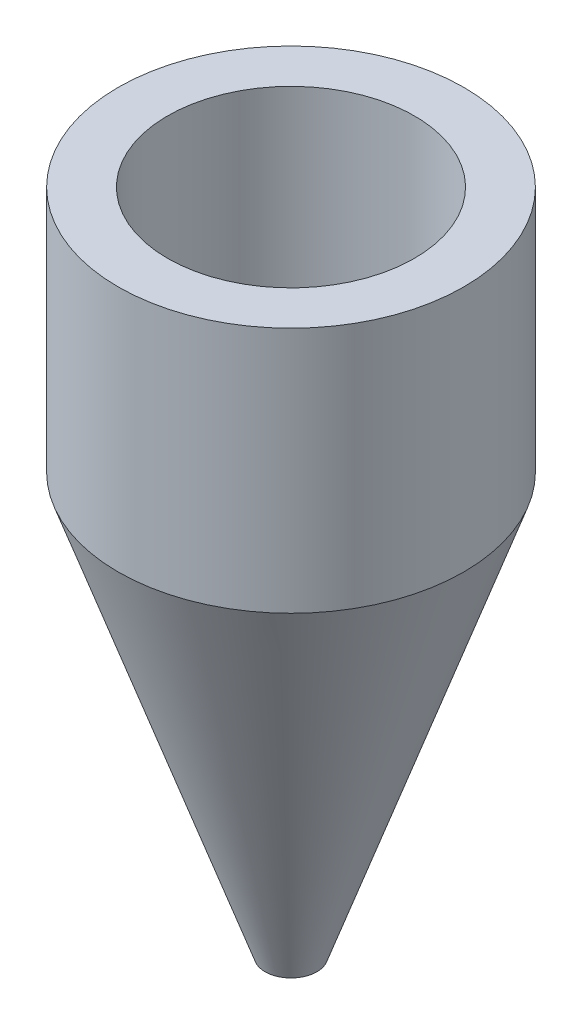
ISO-10303-21;
HEADER;
FILE_DESCRIPTION(('STEP AP214'),'2;1');
FILE_NAME('part.step','',(''),(''),'','','');
FILE_SCHEMA(('AUTOMOTIVE_DESIGN { 1 0 10303 214 1 1 1 1 }'));
ENDSEC;
DATA;
#1=APPLICATION_CONTEXT('core data for automotive mechanical design processes');
#2=APPLICATION_PROTOCOL_DEFINITION('international standard','automotive_design',2000,#1);
#3=PRODUCT_CONTEXT('',#1,'mechanical');
#4=PRODUCT('Part','Part','',(#3));
#5=PRODUCT_RELATED_PRODUCT_CATEGORY('part','',(#4));
#6=PRODUCT_DEFINITION_FORMATION('','',#4);
#7=PRODUCT_DEFINITION_CONTEXT('part definition',#1,'design');
#8=PRODUCT_DEFINITION('design','',#6,#7);
#9=PRODUCT_DEFINITION_SHAPE('','',#8);
#10=(LENGTH_UNIT() NAMED_UNIT(*) SI_UNIT(.MILLI.,.METRE.));
#11=(NAMED_UNIT(*) PLANE_ANGLE_UNIT() SI_UNIT($,.RADIAN.));
#12=(NAMED_UNIT(*) SI_UNIT($,.STERADIAN.) SOLID_ANGLE_UNIT());
#13=UNCERTAINTY_MEASURE_WITH_UNIT(LENGTH_MEASURE(1.E-05),#10,'distance_accuracy_value','');
#14=(GEOMETRIC_REPRESENTATION_CONTEXT(3) GLOBAL_UNCERTAINTY_ASSIGNED_CONTEXT((#13)) GLOBAL_UNIT_ASSIGNED_CONTEXT((#10,
#11,#12)) REPRESENTATION_CONTEXT('',''));
#15=CARTESIAN_POINT('',(0.,0.,0.));
#16=DIRECTION('',(0.,0.,1.));
#17=DIRECTION('',(1.,0.,0.));
#18=AXIS2_PLACEMENT_3D('',#15,#16,#17);
#19=CARTESIAN_POINT('',(0.,0.,0.));
#20=DIRECTION('',(0.,1.,0.));
#21=DIRECTION('',(0.,0.,1.));
#22=AXIS2_PLACEMENT_3D('',#19,#20,#21);
#23=CONICAL_SURFACE('',#22,8.89,0.336674819386727);
#24=CARTESIAN_POINT('',(0.,0.,0.));
#25=DIRECTION('',(0.,-1.,0.));
#26=DIRECTION('',(0.,0.,-1.));
#27=AXIS2_PLACEMENT_3D('',#24,#25,#26);
#28=CIRCLE('',#27,8.89);
#29=CARTESIAN_POINT('',(0.,0.,8.89));
#30=VERTEX_POINT('',#29);
#31=EDGE_CURVE('E60',#30,#30,#28,.T.);
#32=CARTESIAN_POINT('',(0.,-21.59,0.));
#33=DIRECTION('',(0.,-1.,0.));
#34=DIRECTION('',(0.,0.,-1.));
#35=AXIS2_PLACEMENT_3D('',#32,#33,#34);
#36=CIRCLE('',#35,1.3335);
#37=CARTESIAN_POINT('',(0.,-21.59,1.33350000000001));
#38=VERTEX_POINT('',#37);
#39=EDGE_CURVE('E43',#38,#38,#36,.T.);
#40=CARTESIAN_POINT('',(0.,0.,8.89));
#41=CARTESIAN_POINT('',(0.,-0.224895833333333,8.81128645833333));
#42=CARTESIAN_POINT('',(0.,-0.449791666666666,8.73257291666667));
#43=CARTESIAN_POINT('',(0.,-0.899583333333333,8.57514583333333));
#44=CARTESIAN_POINT('',(0.,-1.12447916666667,8.49643229166667));
#45=CARTESIAN_POINT('',(0.,-1.57427083333333,8.33900520833333));
#46=CARTESIAN_POINT('',(0.,-1.79916666666667,8.26029166666667));
#47=CARTESIAN_POINT('',(0.,-2.24895833333333,8.10286458333333));
#48=CARTESIAN_POINT('',(0.,-2.47385416666667,8.02415104166667));
#49=CARTESIAN_POINT('',(0.,-2.92364583333333,7.86672395833333));
#50=CARTESIAN_POINT('',(0.,-3.14854166666667,7.78801041666667));
#51=CARTESIAN_POINT('',(0.,-3.59833333333333,7.63058333333333));
#52=CARTESIAN_POINT('',(0.,-3.82322916666666,7.55186979166667));
#53=CARTESIAN_POINT('',(0.,-4.27302083333333,7.39444270833333));
#54=CARTESIAN_POINT('',(0.,-4.49791666666667,7.31572916666667));
#55=CARTESIAN_POINT('',(0.,-4.94770833333333,7.15830208333333));
#56=CARTESIAN_POINT('',(0.,-5.17260416666667,7.07958854166667));
#57=CARTESIAN_POINT('',(0.,-5.62239583333333,6.92216145833333));
#58=CARTESIAN_POINT('',(0.,-5.84729166666666,6.84344791666667));
#59=CARTESIAN_POINT('',(0.,-6.29708333333333,6.68602083333334));
#60=CARTESIAN_POINT('',(0.,-6.52197916666666,6.60730729166667));
#61=CARTESIAN_POINT('',(0.,-6.97177083333333,6.44988020833334));
#62=CARTESIAN_POINT('',(0.,-7.19666666666666,6.37116666666667));
#63=CARTESIAN_POINT('',(0.,-7.64645833333333,6.21373958333334));
#64=CARTESIAN_POINT('',(0.,-7.87135416666666,6.13502604166667));
#65=CARTESIAN_POINT('',(0.,-8.32114583333333,5.97759895833334));
#66=CARTESIAN_POINT('',(0.,-8.54604166666666,5.89888541666667));
#67=CARTESIAN_POINT('',(0.,-8.99583333333333,5.74145833333334));
#68=CARTESIAN_POINT('',(0.,-9.22072916666666,5.66274479166667));
#69=CARTESIAN_POINT('',(0.,-9.67052083333333,5.50531770833334));
#70=CARTESIAN_POINT('',(0.,-9.89541666666666,5.42660416666667));
#71=CARTESIAN_POINT('',(0.,-10.3452083333333,5.26917708333334));
#72=CARTESIAN_POINT('',(0.,-10.5701041666667,5.19046354166667));
#73=CARTESIAN_POINT('',(0.,-11.0198958333333,5.03303645833334));
#74=CARTESIAN_POINT('',(0.,-11.2447916666667,4.95432291666667));
#75=CARTESIAN_POINT('',(0.,-11.6945833333333,4.79689583333334));
#76=CARTESIAN_POINT('',(0.,-11.9194791666667,4.71818229166667));
#77=CARTESIAN_POINT('',(0.,-12.3692708333333,4.56075520833334));
#78=CARTESIAN_POINT('',(0.,-12.5941666666667,4.48204166666667));
#79=CARTESIAN_POINT('',(0.,-13.0439583333333,4.32461458333334));
#80=CARTESIAN_POINT('',(0.,-13.2688541666667,4.24590104166667));
#81=CARTESIAN_POINT('',(0.,-13.7186458333333,4.08847395833334));
#82=CARTESIAN_POINT('',(0.,-13.9435416666667,4.00976041666667));
#83=CARTESIAN_POINT('',(0.,-14.3933333333333,3.85233333333334));
#84=CARTESIAN_POINT('',(0.,-14.6182291666667,3.77361979166667));
#85=CARTESIAN_POINT('',(0.,-15.0680208333333,3.61619270833334));
#86=CARTESIAN_POINT('',(0.,-15.2929166666667,3.53747916666667));
#87=CARTESIAN_POINT('',(0.,-15.7427083333333,3.38005208333334));
#88=CARTESIAN_POINT('',(0.,-15.9676041666667,3.30133854166667));
#89=CARTESIAN_POINT('',(0.,-16.4173958333333,3.14391145833334));
#90=CARTESIAN_POINT('',(0.,-16.6422916666667,3.06519791666667));
#91=CARTESIAN_POINT('',(0.,-17.0920833333333,2.90777083333334));
#92=CARTESIAN_POINT('',(0.,-17.3169791666667,2.82905729166667));
#93=CARTESIAN_POINT('',(0.,-17.7667708333333,2.67163020833334));
#94=CARTESIAN_POINT('',(0.,-17.9916666666667,2.59291666666667));
#95=CARTESIAN_POINT('',(0.,-18.4414583333333,2.43548958333334));
#96=CARTESIAN_POINT('',(0.,-18.6663541666667,2.35677604166667));
#97=CARTESIAN_POINT('',(0.,-19.1161458333333,2.19934895833334));
#98=CARTESIAN_POINT('',(0.,-19.3410416666667,2.12063541666667));
#99=CARTESIAN_POINT('',(0.,-19.7908333333333,1.96320833333334));
#100=CARTESIAN_POINT('',(0.,-20.0157291666667,1.88449479166667));
#101=CARTESIAN_POINT('',(0.,-20.4655208333333,1.72706770833334));
#102=CARTESIAN_POINT('',(0.,-20.6904166666667,1.64835416666667));
#103=CARTESIAN_POINT('',(0.,-21.1402083333333,1.49092708333334));
#104=CARTESIAN_POINT('',(0.,-21.3651041666667,1.41221354166667));
#105=CARTESIAN_POINT('',(0.,-21.59,1.33350000000001));
#106=B_SPLINE_CURVE_WITH_KNOTS('',3,(#40,#41,#42,#43,#44,#45,#46,#47,#48,#49,#50,#51,#52,#53,
#54,#55,#56,#57,#58,#59,#60,#61,#62,#63,#64,#65,#66,#67,#68,#69,#70,#71,#72,#73,#74,#75,#76,#77,
#78,#79,#80,#81,#82,#83,#84,#85,#86,#87,#88,#89,#90,#91,#92,#93,#94,#95,#96,#97,#98,#99,#100,
#101,#102,#103,#104,#105),.UNSPECIFIED.,.F.,.F.,(4,2,2,2,2,2,2,2,2,2,2,2,2,2,2,2,2,2,2,2,2,2,2,
2,2,2,2,2,2,2,2,2,4),(0.,0.714818590575008,1.42963718115001,2.14445577172502,2.85927436230003,
3.57409295287504,4.28891154345004,5.00373013402505,5.71854872460006,6.43336731517507,
7.14818590575008,7.86300449632508,8.57782308690009,9.2926416774751,10.0074602680501,
10.7222788586251,11.4370974492001,12.1519160397751,12.8667346303501,13.5815532209251,
14.2963718115002,15.0111904020752,15.7260089926502,16.4408275832252,17.1556461738002,
17.8704647643752,18.5852833549502,19.3001019455252,20.0149205361002,20.7297391266752,
21.4445577172502,22.1593763078252,22.8741948984002),.UNSPECIFIED.);
#107=EDGE_CURVE('BSEAM39',#30,#38,#106,.T.);
#108=ORIENTED_EDGE('',*,*,#31,.T.);
#109=ORIENTED_EDGE('',*,*,#39,.F.);
#110=ORIENTED_EDGE('',*,*,#107,.T.);
#111=ORIENTED_EDGE('',*,*,#107,.F.);
#112=EDGE_LOOP('',(#108,#110,#109,#111));
#113=FACE_BOUND('',#112,.T.);
#114=ADVANCED_FACE('F39',(#113),#23,.T.);
#115=CARTESIAN_POINT('',(0.,12.7,0.));
#116=DIRECTION('',(0.,1.,0.));
#117=DIRECTION('',(0.,0.,1.));
#118=AXIS2_PLACEMENT_3D('',#115,#116,#117);
#119=PLANE('',#118);
#120=CARTESIAN_POINT('',(0.,12.7,0.));
#121=DIRECTION('',(0.,1.,0.));
#122=DIRECTION('',(0.,0.,1.));
#123=AXIS2_PLACEMENT_3D('',#120,#121,#122);
#124=CIRCLE('',#123,8.89);
#125=CARTESIAN_POINT('',(0.,12.7,8.89));
#126=VERTEX_POINT('',#125);
#127=EDGE_CURVE('E11',#126,#126,#124,.T.);
#128=ORIENTED_EDGE('',*,*,#127,.T.);
#129=EDGE_LOOP('',(#128));
#130=FACE_BOUND('',#129,.T.);
#131=CARTESIAN_POINT('',(0.,12.7,0.));
#132=DIRECTION('',(0.,1.,0.));
#133=DIRECTION('',(0.,0.,1.));
#134=AXIS2_PLACEMENT_3D('',#131,#132,#133);
#135=CIRCLE('',#134,6.35);
#136=CARTESIAN_POINT('',(0.,12.7,6.35));
#137=VERTEX_POINT('',#136);
#138=EDGE_CURVE('E47',#137,#137,#135,.T.);
#139=ORIENTED_EDGE('',*,*,#138,.F.);
#140=EDGE_LOOP('',(#139));
#141=FACE_BOUND('',#140,.T.);
#142=ADVANCED_FACE('F82',(#130,#141),#119,.T.);
#143=CARTESIAN_POINT('',(0.,12.7,0.));
#144=DIRECTION('',(0.,-1.,0.));
#145=DIRECTION('',(0.,0.,-1.));
#146=AXIS2_PLACEMENT_3D('',#143,#144,#145);
#147=CYLINDRICAL_SURFACE('',#146,8.89);
#148=ORIENTED_EDGE('',*,*,#127,.F.);
#149=EDGE_LOOP('',(#148));
#150=FACE_BOUND('',#149,.T.);
#151=ORIENTED_EDGE('',*,*,#31,.F.);
#152=EDGE_LOOP('',(#151));
#153=FACE_BOUND('',#152,.T.);
#154=ADVANCED_FACE('F41',(#150,#153),#147,.T.);
#155=CARTESIAN_POINT('',(0.,12.7,0.));
#156=DIRECTION('',(0.,-1.,0.));
#157=DIRECTION('',(0.,0.,-1.));
#158=AXIS2_PLACEMENT_3D('',#155,#156,#157);
#159=CYLINDRICAL_SURFACE('',#158,6.35);
#160=ORIENTED_EDGE('',*,*,#138,.T.);
#161=EDGE_LOOP('',(#160));
#162=FACE_BOUND('',#161,.T.);
#163=CARTESIAN_POINT('',(0.,0.,0.));
#164=DIRECTION('',(0.,1.,0.));
#165=DIRECTION('',(0.,0.,1.));
#166=AXIS2_PLACEMENT_3D('',#163,#164,#165);
#167=CIRCLE('',#166,6.35);
#168=CARTESIAN_POINT('',(0.,0.,6.35));
#169=VERTEX_POINT('',#168);
#170=EDGE_CURVE('E63',#169,#169,#167,.T.);
#171=ORIENTED_EDGE('',*,*,#170,.F.);
#172=EDGE_LOOP('',(#171));
#173=FACE_BOUND('',#172,.T.);
#174=ADVANCED_FACE('F73',(#162,#173),#159,.F.);
#175=CARTESIAN_POINT('',(0.,-2.54,0.));
#176=DIRECTION('',(0.,1.,0.));
#177=DIRECTION('',(0.,0.,1.));
#178=AXIS2_PLACEMENT_3D('',#175,#176,#177);
#179=CONICAL_SURFACE('',#178,5.30991824724703,0.38865284315581);
#180=ORIENTED_EDGE('',*,*,#170,.T.);
#181=EDGE_LOOP('',(#180));
#182=FACE_BOUND('',#181,.T.);
#183=CARTESIAN_POINT('',(0.,-2.54,0.));
#184=DIRECTION('',(0.,-1.,0.));
#185=DIRECTION('',(0.,0.,-1.));
#186=AXIS2_PLACEMENT_3D('',#183,#184,#185);
#187=CIRCLE('',#186,5.30991824724703);
#188=CARTESIAN_POINT('',(0.,-2.54,-5.30991824724703));
#189=VERTEX_POINT('',#188);
#190=EDGE_CURVE('E58',#189,#189,#187,.T.);
#191=ORIENTED_EDGE('',*,*,#190,.T.);
#192=EDGE_LOOP('',(#191));
#193=FACE_BOUND('',#192,.T.);
#194=ADVANCED_FACE('F54',(#182,#193),#179,.F.);
#195=CARTESIAN_POINT('',(0.,-2.54,0.));
#196=DIRECTION('',(0.,1.,0.));
#197=DIRECTION('',(0.,0.,1.));
#198=AXIS2_PLACEMENT_3D('',#195,#196,#197);
#199=CONICAL_SURFACE('',#198,5.30991824724703,0.336674819386727);
#200=CARTESIAN_POINT('',(0.,-17.7111949921344,0.));
#201=VERTEX_POINT('',#200);
#202=VERTEX_LOOP('',#201);
#203=FACE_BOUND('',#202,.T.);
#204=ORIENTED_EDGE('',*,*,#190,.F.);
#205=EDGE_LOOP('',(#204));
#206=FACE_BOUND('',#205,.T.);
#207=ADVANCED_FACE('F50',(#203,#206),#199,.F.);
#208=CARTESIAN_POINT('',(-6.35,-21.59,-8.89));
#209=DIRECTION('',(0.,-1.,0.));
#210=DIRECTION('',(0.,0.,-1.));
#211=AXIS2_PLACEMENT_3D('',#208,#209,#210);
#212=PLANE('',#211);
#213=ORIENTED_EDGE('',*,*,#39,.T.);
#214=EDGE_LOOP('',(#213));
#215=FACE_BOUND('',#214,.T.);
#216=ADVANCED_FACE('F53',(#215),#212,.T.);
#217=CLOSED_SHELL('',(#114,#142,#154,#174,#194,#207,#216));
#218=MANIFOLD_SOLID_BREP('B2',#217);
#219=ADVANCED_BREP_SHAPE_REPRESENTATION('',(#18,#218),#14);
#220=SHAPE_DEFINITION_REPRESENTATION(#9,#219);
ENDSEC;
END-ISO-10303-21;
